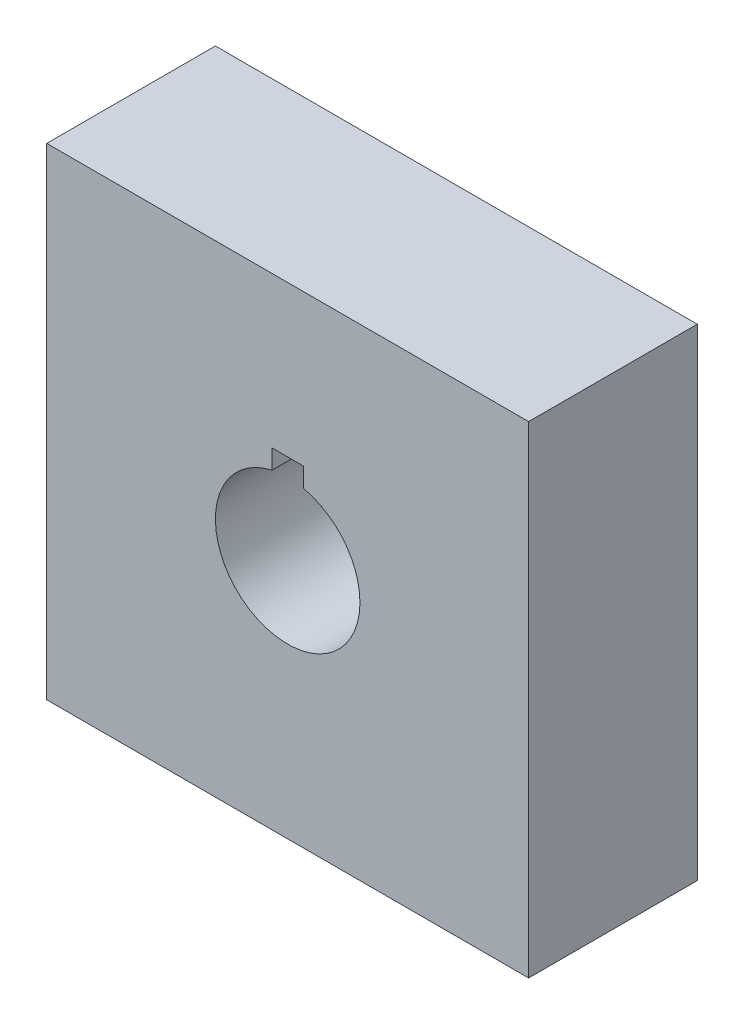
ISO-10303-21;
HEADER;
FILE_DESCRIPTION(('STEP AP214'),'2;1');
FILE_NAME('part.step','',(''),(''),'','','');
FILE_SCHEMA(('AUTOMOTIVE_DESIGN { 1 0 10303 214 1 1 1 1 }'));
ENDSEC;
DATA;
#1=APPLICATION_CONTEXT('core data for automotive mechanical design processes');
#2=APPLICATION_PROTOCOL_DEFINITION('international standard','automotive_design',2000,#1);
#3=PRODUCT_CONTEXT('',#1,'mechanical');
#4=PRODUCT('Part','Part','',(#3));
#5=PRODUCT_RELATED_PRODUCT_CATEGORY('part','',(#4));
#6=PRODUCT_DEFINITION_FORMATION('','',#4);
#7=PRODUCT_DEFINITION_CONTEXT('part definition',#1,'design');
#8=PRODUCT_DEFINITION('design','',#6,#7);
#9=PRODUCT_DEFINITION_SHAPE('','',#8);
#10=(LENGTH_UNIT() NAMED_UNIT(*) SI_UNIT(.MILLI.,.METRE.));
#11=(NAMED_UNIT(*) PLANE_ANGLE_UNIT() SI_UNIT($,.RADIAN.));
#12=(NAMED_UNIT(*) SI_UNIT($,.STERADIAN.) SOLID_ANGLE_UNIT());
#13=UNCERTAINTY_MEASURE_WITH_UNIT(LENGTH_MEASURE(1.E-05),#10,'distance_accuracy_value','');
#14=(GEOMETRIC_REPRESENTATION_CONTEXT(3) GLOBAL_UNCERTAINTY_ASSIGNED_CONTEXT((#13)) GLOBAL_UNIT_ASSIGNED_CONTEXT((#10,
#11,#12)) REPRESENTATION_CONTEXT('',''));
#15=CARTESIAN_POINT('',(0.,0.,0.));
#16=DIRECTION('',(0.,0.,1.));
#17=DIRECTION('',(1.,0.,0.));
#18=AXIS2_PLACEMENT_3D('',#15,#16,#17);
#19=CARTESIAN_POINT('',(-50.,50.,35.));
#20=DIRECTION('',(1.,0.,0.));
#21=DIRECTION('',(0.,1.,0.));
#22=AXIS2_PLACEMENT_3D('',#19,#20,#21);
#23=PLANE('',#22);
#24=DIRECTION('',(0.,-1.,0.));
#25=VECTOR('',#24,1.);
#26=CARTESIAN_POINT('',(-50.,50.,0.));
#27=LINE('',#26,#25);
#28=CARTESIAN_POINT('',(-50.,50.,0.));
#29=VERTEX_POINT('',#28);
#30=CARTESIAN_POINT('',(-50.,-50.,0.));
#31=VERTEX_POINT('',#30);
#32=EDGE_CURVE('E127',#29,#31,#27,.T.);
#33=ORIENTED_EDGE('',*,*,#32,.T.);
#34=DIRECTION('',(0.,0.,-1.));
#35=VECTOR('',#34,1.);
#36=CARTESIAN_POINT('',(-50.,-50.,35.));
#37=LINE('',#36,#35);
#38=CARTESIAN_POINT('',(-50.,-50.,35.));
#39=VERTEX_POINT('',#38);
#40=EDGE_CURVE('E153',#39,#31,#37,.T.);
#41=ORIENTED_EDGE('',*,*,#40,.F.);
#42=DIRECTION('',(0.,-1.,0.));
#43=VECTOR('',#42,1.);
#44=CARTESIAN_POINT('',(-50.,50.,35.));
#45=LINE('',#44,#43);
#46=CARTESIAN_POINT('',(-50.,50.,35.));
#47=VERTEX_POINT('',#46);
#48=EDGE_CURVE('E133',#47,#39,#45,.T.);
#49=ORIENTED_EDGE('',*,*,#48,.F.);
#50=DIRECTION('',(0.,0.,-1.));
#51=VECTOR('',#50,1.);
#52=CARTESIAN_POINT('',(-50.,50.,35.));
#53=LINE('',#52,#51);
#54=EDGE_CURVE('E156',#47,#29,#53,.T.);
#55=ORIENTED_EDGE('',*,*,#54,.T.);
#56=EDGE_LOOP('',(#33,#41,#49,#55));
#57=FACE_BOUND('',#56,.T.);
#58=ADVANCED_FACE('F37',(#57),#23,.F.);
#59=CARTESIAN_POINT('',(-50.,-50.,35.));
#60=DIRECTION('',(0.,1.,0.));
#61=DIRECTION('',(0.,0.,1.));
#62=AXIS2_PLACEMENT_3D('',#59,#60,#61);
#63=PLANE('',#62);
#64=DIRECTION('',(1.,0.,0.));
#65=VECTOR('',#64,1.);
#66=CARTESIAN_POINT('',(-50.,-50.,0.));
#67=LINE('',#66,#65);
#68=CARTESIAN_POINT('',(50.,-50.,0.));
#69=VERTEX_POINT('',#68);
#70=EDGE_CURVE('E143',#31,#69,#67,.T.);
#71=ORIENTED_EDGE('',*,*,#70,.T.);
#72=DIRECTION('',(0.,0.,-1.));
#73=VECTOR('',#72,1.);
#74=CARTESIAN_POINT('',(50.,-50.,35.));
#75=LINE('',#74,#73);
#76=CARTESIAN_POINT('',(50.,-50.,35.));
#77=VERTEX_POINT('',#76);
#78=EDGE_CURVE('E150',#77,#69,#75,.T.);
#79=ORIENTED_EDGE('',*,*,#78,.F.);
#80=DIRECTION('',(1.,0.,0.));
#81=VECTOR('',#80,1.);
#82=CARTESIAN_POINT('',(-50.,-50.,35.));
#83=LINE('',#82,#81);
#84=EDGE_CURVE('E136',#39,#77,#83,.T.);
#85=ORIENTED_EDGE('',*,*,#84,.F.);
#86=ORIENTED_EDGE('',*,*,#40,.T.);
#87=EDGE_LOOP('',(#71,#79,#85,#86));
#88=FACE_BOUND('',#87,.T.);
#89=ADVANCED_FACE('F180',(#88),#63,.F.);
#90=CARTESIAN_POINT('',(50.,-50.,35.));
#91=DIRECTION('',(-1.,0.,0.));
#92=DIRECTION('',(0.,0.,1.));
#93=AXIS2_PLACEMENT_3D('',#90,#91,#92);
#94=PLANE('',#93);
#95=DIRECTION('',(0.,1.,0.));
#96=VECTOR('',#95,1.);
#97=CARTESIAN_POINT('',(50.,-50.,0.));
#98=LINE('',#97,#96);
#99=CARTESIAN_POINT('',(50.,50.,0.));
#100=VERTEX_POINT('',#99);
#101=EDGE_CURVE('E145',#69,#100,#98,.T.);
#102=ORIENTED_EDGE('',*,*,#101,.T.);
#103=DIRECTION('',(0.,0.,-1.));
#104=VECTOR('',#103,1.);
#105=CARTESIAN_POINT('',(50.,50.,35.));
#106=LINE('',#105,#104);
#107=CARTESIAN_POINT('',(50.,50.,35.));
#108=VERTEX_POINT('',#107);
#109=EDGE_CURVE('E141',#108,#100,#106,.T.);
#110=ORIENTED_EDGE('',*,*,#109,.F.);
#111=DIRECTION('',(0.,1.,0.));
#112=VECTOR('',#111,1.);
#113=CARTESIAN_POINT('',(50.,-50.,35.));
#114=LINE('',#113,#112);
#115=EDGE_CURVE('E138',#77,#108,#114,.T.);
#116=ORIENTED_EDGE('',*,*,#115,.F.);
#117=ORIENTED_EDGE('',*,*,#78,.T.);
#118=EDGE_LOOP('',(#102,#110,#116,#117));
#119=FACE_BOUND('',#118,.T.);
#120=ADVANCED_FACE('F185',(#119),#94,.F.);
#121=CARTESIAN_POINT('',(24.6509730247085,50.,35.));
#122=DIRECTION('',(0.,-1.,0.));
#123=DIRECTION('',(0.,0.,-1.));
#124=AXIS2_PLACEMENT_3D('',#121,#122,#123);
#125=PLANE('',#124);
#126=DIRECTION('',(-1.,0.,0.));
#127=VECTOR('',#126,1.);
#128=CARTESIAN_POINT('',(24.6509730247085,50.,0.));
#129=LINE('',#128,#127);
#130=EDGE_CURVE('E134',#100,#29,#129,.T.);
#131=ORIENTED_EDGE('',*,*,#130,.T.);
#132=ORIENTED_EDGE('',*,*,#54,.F.);
#133=DIRECTION('',(-1.,0.,0.));
#134=VECTOR('',#133,1.);
#135=CARTESIAN_POINT('',(24.6509730247085,50.,35.));
#136=LINE('',#135,#134);
#137=EDGE_CURVE('E130',#108,#47,#136,.T.);
#138=ORIENTED_EDGE('',*,*,#137,.F.);
#139=ORIENTED_EDGE('',*,*,#109,.T.);
#140=EDGE_LOOP('',(#131,#132,#138,#139));
#141=FACE_BOUND('',#140,.T.);
#142=ADVANCED_FACE('F199',(#141),#125,.F.);
#143=CARTESIAN_POINT('',(0.,0.,35.));
#144=DIRECTION('',(0.,0.,1.));
#145=DIRECTION('',(1.,0.,0.));
#146=AXIS2_PLACEMENT_3D('',#143,#144,#145);
#147=PLANE('',#146);
#148=CARTESIAN_POINT('',(0.,0.,35.));
#149=DIRECTION('',(0.,0.,1.));
#150=DIRECTION('',(1.,0.,0.));
#151=AXIS2_PLACEMENT_3D('',#148,#149,#150);
#152=CIRCLE('',#151,15.);
#153=CARTESIAN_POINT('',(-3.235,14.6470056666883,35.));
#154=VERTEX_POINT('',#153);
#155=CARTESIAN_POINT('',(3.235,14.6470056666883,35.));
#156=VERTEX_POINT('',#155);
#157=EDGE_CURVE('E51',#154,#156,#152,.T.);
#158=ORIENTED_EDGE('',*,*,#157,.F.);
#159=DIRECTION('',(0.,-1.,0.));
#160=VECTOR('',#159,1.);
#161=CARTESIAN_POINT('',(-3.235,0.,35.));
#162=LINE('',#161,#160);
#163=CARTESIAN_POINT('',(-3.235,18.6470056666883,35.));
#164=VERTEX_POINT('',#163);
#165=EDGE_CURVE('E120',#164,#154,#162,.T.);
#166=ORIENTED_EDGE('',*,*,#165,.F.);
#167=DIRECTION('',(1.,0.,0.));
#168=VECTOR('',#167,1.);
#169=CARTESIAN_POINT('',(0.,18.6470056666883,35.));
#170=LINE('',#169,#168);
#171=CARTESIAN_POINT('',(3.235,18.6470056666883,35.));
#172=VERTEX_POINT('',#171);
#173=EDGE_CURVE('E104',#164,#172,#170,.T.);
#174=ORIENTED_EDGE('',*,*,#173,.T.);
#175=DIRECTION('',(0.,-1.,0.));
#176=VECTOR('',#175,1.);
#177=CARTESIAN_POINT('',(3.235,0.,35.));
#178=LINE('',#177,#176);
#179=EDGE_CURVE('E113',#172,#156,#178,.T.);
#180=ORIENTED_EDGE('',*,*,#179,.T.);
#181=EDGE_LOOP('',(#158,#166,#174,#180));
#182=FACE_BOUND('',#181,.T.);
#183=ORIENTED_EDGE('',*,*,#137,.T.);
#184=ORIENTED_EDGE('',*,*,#48,.T.);
#185=ORIENTED_EDGE('',*,*,#84,.T.);
#186=ORIENTED_EDGE('',*,*,#115,.T.);
#187=EDGE_LOOP('',(#183,#184,#185,#186));
#188=FACE_BOUND('',#187,.T.);
#189=ADVANCED_FACE('F117',(#182,#188),#147,.T.);
#190=CARTESIAN_POINT('',(0.,0.,0.));
#191=DIRECTION('',(0.,0.,1.));
#192=DIRECTION('',(1.,0.,0.));
#193=AXIS2_PLACEMENT_3D('',#190,#191,#192);
#194=PLANE('',#193);
#195=DIRECTION('',(0.,-1.,0.));
#196=VECTOR('',#195,1.);
#197=CARTESIAN_POINT('',(-3.235,0.,0.));
#198=LINE('',#197,#196);
#199=CARTESIAN_POINT('',(-3.235,18.6470056666883,0.));
#200=VERTEX_POINT('',#199);
#201=CARTESIAN_POINT('',(-3.235,14.6470056666883,0.));
#202=VERTEX_POINT('',#201);
#203=EDGE_CURVE('E44',#200,#202,#198,.T.);
#204=ORIENTED_EDGE('',*,*,#203,.T.);
#205=CARTESIAN_POINT('',(0.,0.,0.));
#206=DIRECTION('',(0.,0.,1.));
#207=DIRECTION('',(1.,0.,0.));
#208=AXIS2_PLACEMENT_3D('',#205,#206,#207);
#209=CIRCLE('',#208,15.);
#210=CARTESIAN_POINT('',(3.235,14.6470056666883,0.));
#211=VERTEX_POINT('',#210);
#212=EDGE_CURVE('E11',#202,#211,#209,.T.);
#213=ORIENTED_EDGE('',*,*,#212,.T.);
#214=DIRECTION('',(0.,-1.,0.));
#215=VECTOR('',#214,1.);
#216=CARTESIAN_POINT('',(3.235,0.,0.));
#217=LINE('',#216,#215);
#218=CARTESIAN_POINT('',(3.235,18.6470056666883,0.));
#219=VERTEX_POINT('',#218);
#220=EDGE_CURVE('E159',#219,#211,#217,.T.);
#221=ORIENTED_EDGE('',*,*,#220,.F.);
#222=DIRECTION('',(1.,0.,0.));
#223=VECTOR('',#222,1.);
#224=CARTESIAN_POINT('',(0.,18.6470056666883,0.));
#225=LINE('',#224,#223);
#226=EDGE_CURVE('E107',#200,#219,#225,.T.);
#227=ORIENTED_EDGE('',*,*,#226,.F.);
#228=EDGE_LOOP('',(#204,#213,#221,#227));
#229=FACE_BOUND('',#228,.T.);
#230=ORIENTED_EDGE('',*,*,#32,.F.);
#231=ORIENTED_EDGE('',*,*,#130,.F.);
#232=ORIENTED_EDGE('',*,*,#101,.F.);
#233=ORIENTED_EDGE('',*,*,#70,.F.);
#234=EDGE_LOOP('',(#230,#231,#232,#233));
#235=FACE_BOUND('',#234,.T.);
#236=ADVANCED_FACE('F163',(#229,#235),#194,.F.);
#237=CARTESIAN_POINT('',(0.,0.,-15.));
#238=DIRECTION('',(0.,0.,1.));
#239=DIRECTION('',(1.,0.,0.));
#240=AXIS2_PLACEMENT_3D('',#237,#238,#239);
#241=CYLINDRICAL_SURFACE('',#240,15.);
#242=DIRECTION('',(0.,0.,1.));
#243=VECTOR('',#242,1.);
#244=CARTESIAN_POINT('',(-3.235,14.6470056666883,-15.));
#245=LINE('',#244,#243);
#246=EDGE_CURVE('E125',#202,#154,#245,.T.);
#247=ORIENTED_EDGE('',*,*,#246,.T.);
#248=ORIENTED_EDGE('',*,*,#157,.T.);
#249=DIRECTION('',(0.,0.,1.));
#250=VECTOR('',#249,1.);
#251=CARTESIAN_POINT('',(3.235,14.6470056666883,-15.));
#252=LINE('',#251,#250);
#253=EDGE_CURVE('E110',#211,#156,#252,.T.);
#254=ORIENTED_EDGE('',*,*,#253,.F.);
#255=ORIENTED_EDGE('',*,*,#212,.F.);
#256=EDGE_LOOP('',(#247,#248,#254,#255));
#257=FACE_BOUND('',#256,.T.);
#258=ADVANCED_FACE('F168',(#257),#241,.F.);
#259=CARTESIAN_POINT('',(-3.235,0.,-15.));
#260=DIRECTION('',(-1.,0.,0.));
#261=DIRECTION('',(0.,-1.,0.));
#262=AXIS2_PLACEMENT_3D('',#259,#260,#261);
#263=PLANE('',#262);
#264=DIRECTION('',(0.,0.,1.));
#265=VECTOR('',#264,1.);
#266=CARTESIAN_POINT('',(-3.235,18.6470056666883,-15.));
#267=LINE('',#266,#265);
#268=EDGE_CURVE('E109',#200,#164,#267,.T.);
#269=ORIENTED_EDGE('',*,*,#268,.T.);
#270=ORIENTED_EDGE('',*,*,#165,.T.);
#271=ORIENTED_EDGE('',*,*,#246,.F.);
#272=ORIENTED_EDGE('',*,*,#203,.F.);
#273=EDGE_LOOP('',(#269,#270,#271,#272));
#274=FACE_BOUND('',#273,.T.);
#275=ADVANCED_FACE('F167',(#274),#263,.F.);
#276=CARTESIAN_POINT('',(0.,18.6470056666883,-15.));
#277=DIRECTION('',(0.,-1.,0.));
#278=DIRECTION('',(0.,0.,-1.));
#279=AXIS2_PLACEMENT_3D('',#276,#277,#278);
#280=PLANE('',#279);
#281=ORIENTED_EDGE('',*,*,#226,.T.);
#282=DIRECTION('',(0.,0.,1.));
#283=VECTOR('',#282,1.);
#284=CARTESIAN_POINT('',(3.235,18.6470056666883,-15.));
#285=LINE('',#284,#283);
#286=EDGE_CURVE('E59',#219,#172,#285,.T.);
#287=ORIENTED_EDGE('',*,*,#286,.T.);
#288=ORIENTED_EDGE('',*,*,#173,.F.);
#289=ORIENTED_EDGE('',*,*,#268,.F.);
#290=EDGE_LOOP('',(#281,#287,#288,#289));
#291=FACE_BOUND('',#290,.T.);
#292=ADVANCED_FACE('F101',(#291),#280,.T.);
#293=CARTESIAN_POINT('',(3.235,0.,-15.));
#294=DIRECTION('',(-1.,0.,0.));
#295=DIRECTION('',(0.,-1.,0.));
#296=AXIS2_PLACEMENT_3D('',#293,#294,#295);
#297=PLANE('',#296);
#298=ORIENTED_EDGE('',*,*,#220,.T.);
#299=ORIENTED_EDGE('',*,*,#253,.T.);
#300=ORIENTED_EDGE('',*,*,#179,.F.);
#301=ORIENTED_EDGE('',*,*,#286,.F.);
#302=EDGE_LOOP('',(#298,#299,#300,#301));
#303=FACE_BOUND('',#302,.T.);
#304=ADVANCED_FACE('F114',(#303),#297,.T.);
#305=CLOSED_SHELL('',(#58,#89,#120,#142,#189,#236,#258,#275,#292,#304));
#306=MANIFOLD_SOLID_BREP('B2',#305);
#307=ADVANCED_BREP_SHAPE_REPRESENTATION('',(#18,#306),#14);
#308=SHAPE_DEFINITION_REPRESENTATION(#9,#307);
ENDSEC;
END-ISO-10303-21;
